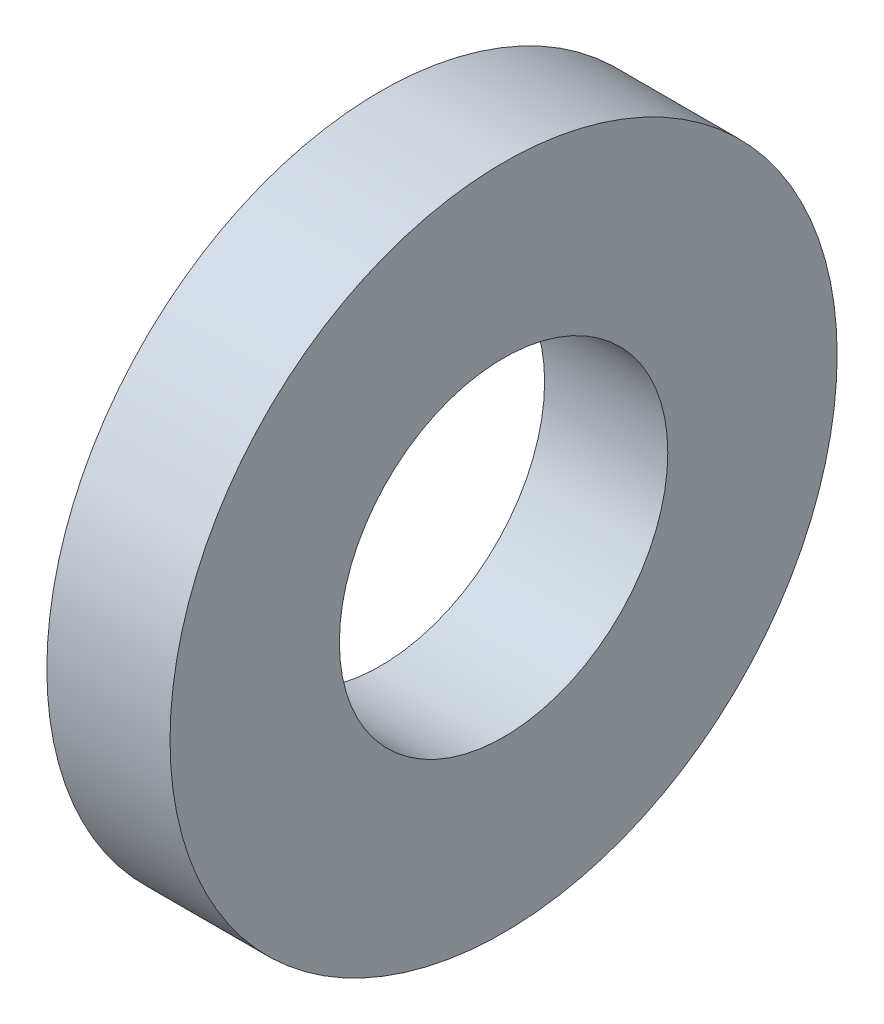
ISO-10303-21;
HEADER;
FILE_DESCRIPTION(('STEP AP214'),'2;1');
FILE_NAME('part.step','',(''),(''),'','','');
FILE_SCHEMA(('AUTOMOTIVE_DESIGN { 1 0 10303 214 1 1 1 1 }'));
ENDSEC;
DATA;
#1=APPLICATION_CONTEXT('core data for automotive mechanical design processes');
#2=APPLICATION_PROTOCOL_DEFINITION('international standard','automotive_design',2000,#1);
#3=PRODUCT_CONTEXT('',#1,'mechanical');
#4=PRODUCT('Part','Part','',(#3));
#5=PRODUCT_RELATED_PRODUCT_CATEGORY('part','',(#4));
#6=PRODUCT_DEFINITION_FORMATION('','',#4);
#7=PRODUCT_DEFINITION_CONTEXT('part definition',#1,'design');
#8=PRODUCT_DEFINITION('design','',#6,#7);
#9=PRODUCT_DEFINITION_SHAPE('','',#8);
#10=(LENGTH_UNIT() NAMED_UNIT(*) SI_UNIT(.MILLI.,.METRE.));
#11=(NAMED_UNIT(*) PLANE_ANGLE_UNIT() SI_UNIT($,.RADIAN.));
#12=(NAMED_UNIT(*) SI_UNIT($,.STERADIAN.) SOLID_ANGLE_UNIT());
#13=UNCERTAINTY_MEASURE_WITH_UNIT(LENGTH_MEASURE(1.E-05),#10,'distance_accuracy_value','');
#14=(GEOMETRIC_REPRESENTATION_CONTEXT(3) GLOBAL_UNCERTAINTY_ASSIGNED_CONTEXT((#13)) GLOBAL_UNIT_ASSIGNED_CONTEXT((#10,
#11,#12)) REPRESENTATION_CONTEXT('',''));
#15=CARTESIAN_POINT('',(0.,0.,0.));
#16=DIRECTION('',(0.,0.,1.));
#17=DIRECTION('',(1.,0.,0.));
#18=AXIS2_PLACEMENT_3D('',#15,#16,#17);
#19=CARTESIAN_POINT('',(2.4,0.,0.));
#20=DIRECTION('',(1.,0.,0.));
#21=DIRECTION('',(0.,0.,-1.));
#22=AXIS2_PLACEMENT_3D('',#19,#20,#21);
#23=PLANE('',#22);
#24=CARTESIAN_POINT('',(2.4,0.,0.));
#25=DIRECTION('',(1.,0.,0.));
#26=DIRECTION('',(0.,0.,-1.));
#27=AXIS2_PLACEMENT_3D('',#24,#25,#26);
#28=CIRCLE('',#27,6.5);
#29=CARTESIAN_POINT('',(2.4,0.,-6.5));
#30=VERTEX_POINT('',#29);
#31=EDGE_CURVE('E10',#30,#30,#28,.T.);
#32=ORIENTED_EDGE('',*,*,#31,.T.);
#33=EDGE_LOOP('',(#32));
#34=FACE_BOUND('',#33,.T.);
#35=CARTESIAN_POINT('',(2.4,0.,0.));
#36=DIRECTION('',(1.,0.,0.));
#37=DIRECTION('',(0.,0.,-1.));
#38=AXIS2_PLACEMENT_3D('',#35,#36,#37);
#39=CIRCLE('',#38,3.2);
#40=CARTESIAN_POINT('',(2.4,0.,-3.2));
#41=VERTEX_POINT('',#40);
#42=EDGE_CURVE('E42',#41,#41,#39,.T.);
#43=ORIENTED_EDGE('',*,*,#42,.F.);
#44=EDGE_LOOP('',(#43));
#45=FACE_BOUND('',#44,.T.);
#46=ADVANCED_FACE('F31',(#34,#45),#23,.T.);
#47=CARTESIAN_POINT('',(0.,0.,0.));
#48=DIRECTION('',(1.,0.,0.));
#49=DIRECTION('',(0.,0.,-1.));
#50=AXIS2_PLACEMENT_3D('',#47,#48,#49);
#51=PLANE('',#50);
#52=CARTESIAN_POINT('',(0.,0.,0.));
#53=DIRECTION('',(1.,0.,0.));
#54=DIRECTION('',(0.,0.,-1.));
#55=AXIS2_PLACEMENT_3D('',#52,#53,#54);
#56=CIRCLE('',#55,6.5);
#57=CARTESIAN_POINT('',(0.,0.,-6.5));
#58=VERTEX_POINT('',#57);
#59=EDGE_CURVE('E35',#58,#58,#56,.T.);
#60=ORIENTED_EDGE('',*,*,#59,.F.);
#61=EDGE_LOOP('',(#60));
#62=FACE_BOUND('',#61,.T.);
#63=CARTESIAN_POINT('',(0.,0.,0.));
#64=DIRECTION('',(1.,0.,0.));
#65=DIRECTION('',(0.,0.,-1.));
#66=AXIS2_PLACEMENT_3D('',#63,#64,#65);
#67=CIRCLE('',#66,3.2);
#68=CARTESIAN_POINT('',(0.,0.,-3.2));
#69=VERTEX_POINT('',#68);
#70=EDGE_CURVE('E44',#69,#69,#67,.T.);
#71=ORIENTED_EDGE('',*,*,#70,.T.);
#72=EDGE_LOOP('',(#71));
#73=FACE_BOUND('',#72,.T.);
#74=ADVANCED_FACE('F54',(#62,#73),#51,.F.);
#75=CARTESIAN_POINT('',(2.4,0.,0.));
#76=DIRECTION('',(-1.,0.,0.));
#77=DIRECTION('',(0.,0.,1.));
#78=AXIS2_PLACEMENT_3D('',#75,#76,#77);
#79=CYLINDRICAL_SURFACE('',#78,6.5);
#80=ORIENTED_EDGE('',*,*,#31,.F.);
#81=EDGE_LOOP('',(#80));
#82=FACE_BOUND('',#81,.T.);
#83=ORIENTED_EDGE('',*,*,#59,.T.);
#84=EDGE_LOOP('',(#83));
#85=FACE_BOUND('',#84,.T.);
#86=ADVANCED_FACE('F33',(#82,#85),#79,.T.);
#87=CARTESIAN_POINT('',(2.4,0.,0.));
#88=DIRECTION('',(-1.,0.,0.));
#89=DIRECTION('',(0.,0.,1.));
#90=AXIS2_PLACEMENT_3D('',#87,#88,#89);
#91=CYLINDRICAL_SURFACE('',#90,3.2);
#92=ORIENTED_EDGE('',*,*,#42,.T.);
#93=EDGE_LOOP('',(#92));
#94=FACE_BOUND('',#93,.T.);
#95=ORIENTED_EDGE('',*,*,#70,.F.);
#96=EDGE_LOOP('',(#95));
#97=FACE_BOUND('',#96,.T.);
#98=ADVANCED_FACE('F50',(#94,#97),#91,.F.);
#99=CLOSED_SHELL('',(#46,#74,#86,#98));
#100=MANIFOLD_SOLID_BREP('B2',#99);
#101=ADVANCED_BREP_SHAPE_REPRESENTATION('',(#18,#100),#14);
#102=SHAPE_DEFINITION_REPRESENTATION(#9,#101);
ENDSEC;
END-ISO-10303-21;
